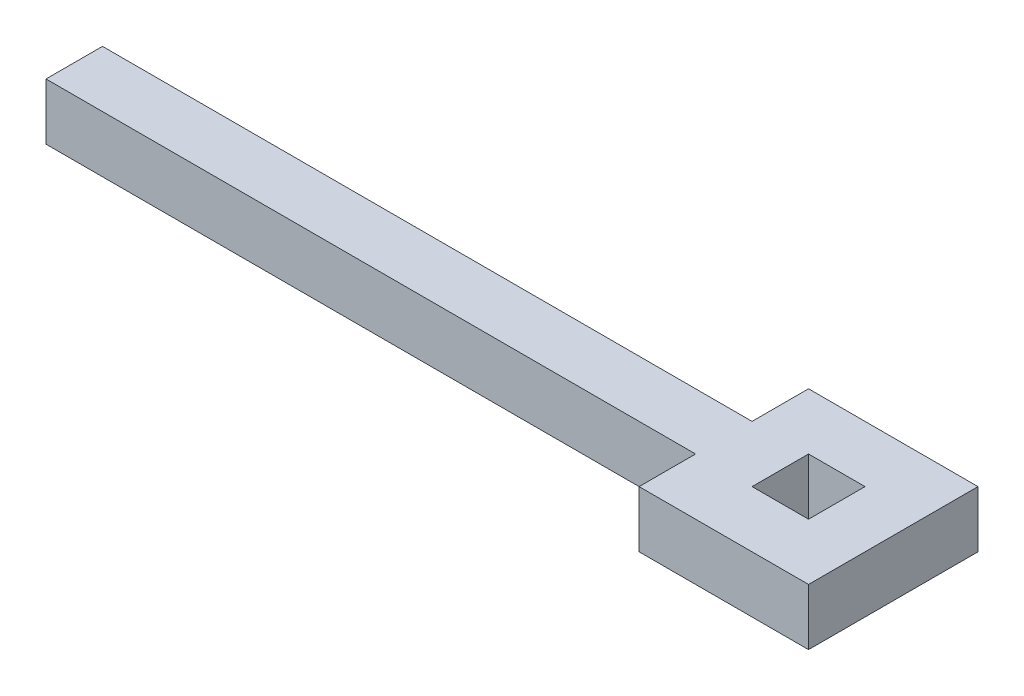
ISO-10303-21;
HEADER;
FILE_DESCRIPTION(('STEP AP214'),'2;1');
FILE_NAME('part.step','',(''),(''),'','','');
FILE_SCHEMA(('AUTOMOTIVE_DESIGN { 1 0 10303 214 1 1 1 1 }'));
ENDSEC;
DATA;
#1=APPLICATION_CONTEXT('core data for automotive mechanical design processes');
#2=APPLICATION_PROTOCOL_DEFINITION('international standard','automotive_design',2000,#1);
#3=PRODUCT_CONTEXT('',#1,'mechanical');
#4=PRODUCT('Part','Part','',(#3));
#5=PRODUCT_RELATED_PRODUCT_CATEGORY('part','',(#4));
#6=PRODUCT_DEFINITION_FORMATION('','',#4);
#7=PRODUCT_DEFINITION_CONTEXT('part definition',#1,'design');
#8=PRODUCT_DEFINITION('design','',#6,#7);
#9=PRODUCT_DEFINITION_SHAPE('','',#8);
#10=(LENGTH_UNIT() NAMED_UNIT(*) SI_UNIT(.MILLI.,.METRE.));
#11=(NAMED_UNIT(*) PLANE_ANGLE_UNIT() SI_UNIT($,.RADIAN.));
#12=(NAMED_UNIT(*) SI_UNIT($,.STERADIAN.) SOLID_ANGLE_UNIT());
#13=UNCERTAINTY_MEASURE_WITH_UNIT(LENGTH_MEASURE(1.E-05),#10,'distance_accuracy_value','');
#14=(GEOMETRIC_REPRESENTATION_CONTEXT(3) GLOBAL_UNCERTAINTY_ASSIGNED_CONTEXT((#13)) GLOBAL_UNIT_ASSIGNED_CONTEXT((#10,
#11,#12)) REPRESENTATION_CONTEXT('',''));
#15=CARTESIAN_POINT('',(0.,0.,0.));
#16=DIRECTION('',(0.,0.,1.));
#17=DIRECTION('',(1.,0.,0.));
#18=AXIS2_PLACEMENT_3D('',#15,#16,#17);
#19=CARTESIAN_POINT('',(0.,12.7,-12.7));
#20=DIRECTION('',(0.,0.,1.));
#21=DIRECTION('',(1.,0.,0.));
#22=AXIS2_PLACEMENT_3D('',#19,#20,#21);
#23=PLANE('',#22);
#24=DIRECTION('',(-1.,0.,0.));
#25=VECTOR('',#24,1.);
#26=CARTESIAN_POINT('',(0.,0.,-12.7));
#27=LINE('',#26,#25);
#28=CARTESIAN_POINT('',(0.,0.,-12.7));
#29=VERTEX_POINT('',#28);
#30=CARTESIAN_POINT('',(-146.05,0.,-12.7));
#31=VERTEX_POINT('',#30);
#32=EDGE_CURVE('E213',#29,#31,#27,.T.);
#33=ORIENTED_EDGE('',*,*,#32,.T.);
#34=DIRECTION('',(0.,-1.,0.));
#35=VECTOR('',#34,1.);
#36=CARTESIAN_POINT('',(-146.05,12.7,-12.7));
#37=LINE('',#36,#35);
#38=CARTESIAN_POINT('',(-146.05,12.7,-12.7));
#39=VERTEX_POINT('',#38);
#40=EDGE_CURVE('E239',#39,#31,#37,.T.);
#41=ORIENTED_EDGE('',*,*,#40,.F.);
#42=DIRECTION('',(-1.,0.,0.));
#43=VECTOR('',#42,1.);
#44=CARTESIAN_POINT('',(0.,12.7,-12.7));
#45=LINE('',#44,#43);
#46=CARTESIAN_POINT('',(0.,12.7,-12.7));
#47=VERTEX_POINT('',#46);
#48=EDGE_CURVE('E214',#47,#39,#45,.T.);
#49=ORIENTED_EDGE('',*,*,#48,.F.);
#50=DIRECTION('',(0.,-1.,0.));
#51=VECTOR('',#50,1.);
#52=CARTESIAN_POINT('',(0.,12.7,-12.7));
#53=LINE('',#52,#51);
#54=EDGE_CURVE('E243',#47,#29,#53,.T.);
#55=ORIENTED_EDGE('',*,*,#54,.T.);
#56=EDGE_LOOP('',(#33,#41,#49,#55));
#57=FACE_BOUND('',#56,.T.);
#58=ADVANCED_FACE('F43',(#57),#23,.F.);
#59=CARTESIAN_POINT('',(-146.05,12.7,0.));
#60=DIRECTION('',(1.,0.,0.));
#61=DIRECTION('',(0.,0.,-1.));
#62=AXIS2_PLACEMENT_3D('',#59,#60,#61);
#63=PLANE('',#62);
#64=DIRECTION('',(0.,0.,1.));
#65=VECTOR('',#64,1.);
#66=CARTESIAN_POINT('',(-146.05,0.,0.));
#67=LINE('',#66,#65);
#68=CARTESIAN_POINT('',(-146.05,0.,0.));
#69=VERTEX_POINT('',#68);
#70=EDGE_CURVE('E227',#31,#69,#67,.T.);
#71=ORIENTED_EDGE('',*,*,#70,.T.);
#72=DIRECTION('',(0.,-1.,0.));
#73=VECTOR('',#72,1.);
#74=CARTESIAN_POINT('',(-146.05,12.7,0.));
#75=LINE('',#74,#73);
#76=CARTESIAN_POINT('',(-146.05,12.7,0.));
#77=VERTEX_POINT('',#76);
#78=EDGE_CURVE('E235',#77,#69,#75,.T.);
#79=ORIENTED_EDGE('',*,*,#78,.F.);
#80=DIRECTION('',(0.,0.,1.));
#81=VECTOR('',#80,1.);
#82=CARTESIAN_POINT('',(-146.05,12.7,0.));
#83=LINE('',#82,#81);
#84=EDGE_CURVE('E217',#39,#77,#83,.T.);
#85=ORIENTED_EDGE('',*,*,#84,.F.);
#86=ORIENTED_EDGE('',*,*,#40,.T.);
#87=EDGE_LOOP('',(#71,#79,#85,#86));
#88=FACE_BOUND('',#87,.T.);
#89=ADVANCED_FACE('F275',(#88),#63,.F.);
#90=CARTESIAN_POINT('',(0.,12.7,0.));
#91=DIRECTION('',(0.,0.,-1.));
#92=DIRECTION('',(-1.,0.,0.));
#93=AXIS2_PLACEMENT_3D('',#90,#91,#92);
#94=PLANE('',#93);
#95=DIRECTION('',(1.,0.,0.));
#96=VECTOR('',#95,1.);
#97=CARTESIAN_POINT('',(0.,0.,0.));
#98=LINE('',#97,#96);
#99=CARTESIAN_POINT('',(0.,0.,0.));
#100=VERTEX_POINT('',#99);
#101=EDGE_CURVE('E218',#69,#100,#98,.T.);
#102=ORIENTED_EDGE('',*,*,#101,.T.);
#103=DIRECTION('',(0.,-1.,0.));
#104=VECTOR('',#103,1.);
#105=CARTESIAN_POINT('',(0.,12.7,0.));
#106=LINE('',#105,#104);
#107=CARTESIAN_POINT('',(0.,12.7,0.));
#108=VERTEX_POINT('',#107);
#109=EDGE_CURVE('E224',#108,#100,#106,.T.);
#110=ORIENTED_EDGE('',*,*,#109,.F.);
#111=DIRECTION('',(1.,0.,0.));
#112=VECTOR('',#111,1.);
#113=CARTESIAN_POINT('',(0.,12.7,0.));
#114=LINE('',#113,#112);
#115=EDGE_CURVE('E221',#77,#108,#114,.T.);
#116=ORIENTED_EDGE('',*,*,#115,.F.);
#117=ORIENTED_EDGE('',*,*,#78,.T.);
#118=EDGE_LOOP('',(#102,#110,#116,#117));
#119=FACE_BOUND('',#118,.T.);
#120=ADVANCED_FACE('F280',(#119),#94,.F.);
#121=CARTESIAN_POINT('',(0.,12.7,0.));
#122=DIRECTION('',(0.,1.,0.));
#123=DIRECTION('',(0.,0.,1.));
#124=AXIS2_PLACEMENT_3D('',#121,#122,#123);
#125=PLANE('',#124);
#126=DIRECTION('',(0.,0.,1.));
#127=VECTOR('',#126,1.);
#128=CARTESIAN_POINT('',(12.7,12.7,0.));
#129=LINE('',#128,#127);
#130=CARTESIAN_POINT('',(12.7,12.7,-12.7));
#131=VERTEX_POINT('',#130);
#132=CARTESIAN_POINT('',(12.7,12.7,0.));
#133=VERTEX_POINT('',#132);
#134=EDGE_CURVE('E58',#131,#133,#129,.T.);
#135=ORIENTED_EDGE('',*,*,#134,.F.);
#136=DIRECTION('',(-1.,0.,0.));
#137=VECTOR('',#136,1.);
#138=CARTESIAN_POINT('',(12.7,12.7,-12.7));
#139=LINE('',#138,#137);
#140=CARTESIAN_POINT('',(25.4,12.7,-12.7));
#141=VERTEX_POINT('',#140);
#142=EDGE_CURVE('E153',#141,#131,#139,.T.);
#143=ORIENTED_EDGE('',*,*,#142,.F.);
#144=DIRECTION('',(0.,0.,-1.));
#145=VECTOR('',#144,1.);
#146=CARTESIAN_POINT('',(25.4,12.7,0.));
#147=LINE('',#146,#145);
#148=CARTESIAN_POINT('',(25.4,12.7,0.));
#149=VERTEX_POINT('',#148);
#150=EDGE_CURVE('E135',#149,#141,#147,.T.);
#151=ORIENTED_EDGE('',*,*,#150,.F.);
#152=DIRECTION('',(1.,0.,0.));
#153=VECTOR('',#152,1.);
#154=CARTESIAN_POINT('',(12.7,12.7,0.));
#155=LINE('',#154,#153);
#156=EDGE_CURVE('E145',#133,#149,#155,.T.);
#157=ORIENTED_EDGE('',*,*,#156,.F.);
#158=EDGE_LOOP('',(#135,#143,#151,#157));
#159=FACE_BOUND('',#158,.T.);
#160=ORIENTED_EDGE('',*,*,#115,.T.);
#161=DIRECTION('',(0.,0.,1.));
#162=VECTOR('',#161,1.);
#163=CARTESIAN_POINT('',(0.,12.7,12.7));
#164=LINE('',#163,#162);
#165=CARTESIAN_POINT('',(0.,12.7,12.7));
#166=VERTEX_POINT('',#165);
#167=EDGE_CURVE('E194',#108,#166,#164,.T.);
#168=ORIENTED_EDGE('',*,*,#167,.T.);
#169=DIRECTION('',(-1.,0.,0.));
#170=VECTOR('',#169,1.);
#171=CARTESIAN_POINT('',(38.1,12.7,12.7));
#172=LINE('',#171,#170);
#173=CARTESIAN_POINT('',(38.1,12.7,12.7));
#174=VERTEX_POINT('',#173);
#175=EDGE_CURVE('E182',#174,#166,#172,.T.);
#176=ORIENTED_EDGE('',*,*,#175,.F.);
#177=DIRECTION('',(0.,0.,1.));
#178=VECTOR('',#177,1.);
#179=CARTESIAN_POINT('',(38.1,12.7,12.7));
#180=LINE('',#179,#178);
#181=CARTESIAN_POINT('',(38.1,12.7,-25.4));
#182=VERTEX_POINT('',#181);
#183=EDGE_CURVE('E179',#182,#174,#180,.T.);
#184=ORIENTED_EDGE('',*,*,#183,.F.);
#185=DIRECTION('',(-1.,0.,0.));
#186=VECTOR('',#185,1.);
#187=CARTESIAN_POINT('',(38.1,12.7,-25.4));
#188=LINE('',#187,#186);
#189=CARTESIAN_POINT('',(0.,12.7,-25.4));
#190=VERTEX_POINT('',#189);
#191=EDGE_CURVE('E201',#182,#190,#188,.T.);
#192=ORIENTED_EDGE('',*,*,#191,.T.);
#193=EDGE_CURVE('E173',#190,#47,#164,.T.);
#194=ORIENTED_EDGE('',*,*,#193,.T.);
#195=ORIENTED_EDGE('',*,*,#48,.T.);
#196=ORIENTED_EDGE('',*,*,#84,.T.);
#197=EDGE_LOOP('',(#160,#168,#176,#184,#192,#194,#195,#196));
#198=FACE_BOUND('',#197,.T.);
#199=ADVANCED_FACE('F150',(#159,#198),#125,.T.);
#200=CARTESIAN_POINT('',(0.,0.,0.));
#201=DIRECTION('',(0.,1.,0.));
#202=DIRECTION('',(0.,0.,1.));
#203=AXIS2_PLACEMENT_3D('',#200,#201,#202);
#204=PLANE('',#203);
#205=DIRECTION('',(-1.,0.,0.));
#206=VECTOR('',#205,1.);
#207=CARTESIAN_POINT('',(0.,0.,-12.7));
#208=LINE('',#207,#206);
#209=CARTESIAN_POINT('',(25.4,0.,-12.7));
#210=VERTEX_POINT('',#209);
#211=CARTESIAN_POINT('',(12.7,0.,-12.7));
#212=VERTEX_POINT('',#211);
#213=EDGE_CURVE('E51',#210,#212,#208,.T.);
#214=ORIENTED_EDGE('',*,*,#213,.T.);
#215=DIRECTION('',(0.,0.,1.));
#216=VECTOR('',#215,1.);
#217=CARTESIAN_POINT('',(12.7,0.,0.));
#218=LINE('',#217,#216);
#219=CARTESIAN_POINT('',(12.7,0.,0.));
#220=VERTEX_POINT('',#219);
#221=EDGE_CURVE('E11',#212,#220,#218,.T.);
#222=ORIENTED_EDGE('',*,*,#221,.T.);
#223=DIRECTION('',(1.,0.,0.));
#224=VECTOR('',#223,1.);
#225=CARTESIAN_POINT('',(0.,0.,0.));
#226=LINE('',#225,#224);
#227=CARTESIAN_POINT('',(25.4,0.,0.));
#228=VERTEX_POINT('',#227);
#229=EDGE_CURVE('E247',#220,#228,#226,.T.);
#230=ORIENTED_EDGE('',*,*,#229,.T.);
#231=DIRECTION('',(0.,0.,-1.));
#232=VECTOR('',#231,1.);
#233=CARTESIAN_POINT('',(25.4,0.,0.));
#234=LINE('',#233,#232);
#235=EDGE_CURVE('E138',#228,#210,#234,.T.);
#236=ORIENTED_EDGE('',*,*,#235,.T.);
#237=EDGE_LOOP('',(#214,#222,#230,#236));
#238=FACE_BOUND('',#237,.T.);
#239=ORIENTED_EDGE('',*,*,#32,.F.);
#240=DIRECTION('',(0.,0.,-1.));
#241=VECTOR('',#240,1.);
#242=CARTESIAN_POINT('',(0.,0.,12.7));
#243=LINE('',#242,#241);
#244=CARTESIAN_POINT('',(0.,0.,-25.4));
#245=VERTEX_POINT('',#244);
#246=EDGE_CURVE('E186',#29,#245,#243,.T.);
#247=ORIENTED_EDGE('',*,*,#246,.T.);
#248=DIRECTION('',(-1.,0.,0.));
#249=VECTOR('',#248,1.);
#250=CARTESIAN_POINT('',(38.1,0.,-25.4));
#251=LINE('',#250,#249);
#252=CARTESIAN_POINT('',(38.1,0.,-25.4));
#253=VERTEX_POINT('',#252);
#254=EDGE_CURVE('E205',#253,#245,#251,.T.);
#255=ORIENTED_EDGE('',*,*,#254,.F.);
#256=DIRECTION('',(0.,0.,-1.));
#257=VECTOR('',#256,1.);
#258=CARTESIAN_POINT('',(38.1,0.,12.7));
#259=LINE('',#258,#257);
#260=CARTESIAN_POINT('',(38.1,0.,12.7));
#261=VERTEX_POINT('',#260);
#262=EDGE_CURVE('E172',#261,#253,#259,.T.);
#263=ORIENTED_EDGE('',*,*,#262,.F.);
#264=DIRECTION('',(-1.,0.,0.));
#265=VECTOR('',#264,1.);
#266=CARTESIAN_POINT('',(38.1,0.,12.7));
#267=LINE('',#266,#265);
#268=CARTESIAN_POINT('',(0.,0.,12.7));
#269=VERTEX_POINT('',#268);
#270=EDGE_CURVE('E209',#261,#269,#267,.T.);
#271=ORIENTED_EDGE('',*,*,#270,.T.);
#272=EDGE_CURVE('E187',#269,#100,#243,.T.);
#273=ORIENTED_EDGE('',*,*,#272,.T.);
#274=ORIENTED_EDGE('',*,*,#101,.F.);
#275=ORIENTED_EDGE('',*,*,#70,.F.);
#276=EDGE_LOOP('',(#239,#247,#255,#263,#271,#273,#274,#275));
#277=FACE_BOUND('',#276,.T.);
#278=ADVANCED_FACE('F254',(#238,#277),#204,.F.);
#279=CARTESIAN_POINT('',(0.,0.,0.));
#280=DIRECTION('',(-1.,0.,0.));
#281=DIRECTION('',(0.,0.,1.));
#282=AXIS2_PLACEMENT_3D('',#279,#280,#281);
#283=PLANE('',#282);
#284=ORIENTED_EDGE('',*,*,#54,.F.);
#285=ORIENTED_EDGE('',*,*,#193,.F.);
#286=DIRECTION('',(0.,1.,0.));
#287=VECTOR('',#286,1.);
#288=CARTESIAN_POINT('',(0.,0.,-25.4));
#289=LINE('',#288,#287);
#290=EDGE_CURVE('E191',#245,#190,#289,.T.);
#291=ORIENTED_EDGE('',*,*,#290,.F.);
#292=ORIENTED_EDGE('',*,*,#246,.F.);
#293=EDGE_LOOP('',(#284,#285,#291,#292));
#294=FACE_BOUND('',#293,.T.);
#295=ADVANCED_FACE('F271',(#294),#283,.T.);
#296=CARTESIAN_POINT('',(38.1,0.,12.7));
#297=DIRECTION('',(0.,0.,-1.));
#298=DIRECTION('',(-1.,0.,0.));
#299=AXIS2_PLACEMENT_3D('',#296,#297,#298);
#300=PLANE('',#299);
#301=DIRECTION('',(0.,-1.,0.));
#302=VECTOR('',#301,1.);
#303=CARTESIAN_POINT('',(0.,0.,12.7));
#304=LINE('',#303,#302);
#305=EDGE_CURVE('E163',#166,#269,#304,.T.);
#306=ORIENTED_EDGE('',*,*,#305,.T.);
#307=ORIENTED_EDGE('',*,*,#270,.F.);
#308=DIRECTION('',(0.,-1.,0.));
#309=VECTOR('',#308,1.);
#310=CARTESIAN_POINT('',(38.1,0.,12.7));
#311=LINE('',#310,#309);
#312=EDGE_CURVE('E168',#174,#261,#311,.T.);
#313=ORIENTED_EDGE('',*,*,#312,.F.);
#314=ORIENTED_EDGE('',*,*,#175,.T.);
#315=EDGE_LOOP('',(#306,#307,#313,#314));
#316=FACE_BOUND('',#315,.T.);
#317=ADVANCED_FACE('F310',(#316),#300,.F.);
#318=CARTESIAN_POINT('',(38.1,0.,-25.4));
#319=DIRECTION('',(0.,0.,1.));
#320=DIRECTION('',(1.,0.,0.));
#321=AXIS2_PLACEMENT_3D('',#318,#319,#320);
#322=PLANE('',#321);
#323=ORIENTED_EDGE('',*,*,#290,.T.);
#324=ORIENTED_EDGE('',*,*,#191,.F.);
#325=DIRECTION('',(0.,1.,0.));
#326=VECTOR('',#325,1.);
#327=CARTESIAN_POINT('',(38.1,0.,-25.4));
#328=LINE('',#327,#326);
#329=EDGE_CURVE('E176',#253,#182,#328,.T.);
#330=ORIENTED_EDGE('',*,*,#329,.F.);
#331=ORIENTED_EDGE('',*,*,#254,.T.);
#332=EDGE_LOOP('',(#323,#324,#330,#331));
#333=FACE_BOUND('',#332,.T.);
#334=ADVANCED_FACE('F302',(#333),#322,.F.);
#335=CARTESIAN_POINT('',(38.1,0.,0.));
#336=DIRECTION('',(-1.,0.,0.));
#337=DIRECTION('',(0.,0.,1.));
#338=AXIS2_PLACEMENT_3D('',#335,#336,#337);
#339=PLANE('',#338);
#340=ORIENTED_EDGE('',*,*,#312,.T.);
#341=ORIENTED_EDGE('',*,*,#262,.T.);
#342=ORIENTED_EDGE('',*,*,#329,.T.);
#343=ORIENTED_EDGE('',*,*,#183,.T.);
#344=EDGE_LOOP('',(#340,#341,#342,#343));
#345=FACE_BOUND('',#344,.T.);
#346=ADVANCED_FACE('F268',(#345),#339,.F.);
#347=ORIENTED_EDGE('',*,*,#167,.F.);
#348=ORIENTED_EDGE('',*,*,#109,.T.);
#349=ORIENTED_EDGE('',*,*,#272,.F.);
#350=ORIENTED_EDGE('',*,*,#305,.F.);
#351=EDGE_LOOP('',(#347,#348,#349,#350));
#352=FACE_BOUND('',#351,.T.);
#353=ADVANCED_FACE('F261',(#352),#283,.T.);
#354=CARTESIAN_POINT('',(12.7,-25.4,0.));
#355=DIRECTION('',(-1.,0.,0.));
#356=DIRECTION('',(0.,0.,1.));
#357=AXIS2_PLACEMENT_3D('',#354,#355,#356);
#358=PLANE('',#357);
#359=DIRECTION('',(0.,1.,0.));
#360=VECTOR('',#359,1.);
#361=CARTESIAN_POINT('',(12.7,-25.4,-12.7));
#362=LINE('',#361,#360);
#363=EDGE_CURVE('E160',#212,#131,#362,.T.);
#364=ORIENTED_EDGE('',*,*,#363,.T.);
#365=ORIENTED_EDGE('',*,*,#134,.T.);
#366=DIRECTION('',(0.,1.,0.));
#367=VECTOR('',#366,1.);
#368=CARTESIAN_POINT('',(12.7,-25.4,0.));
#369=LINE('',#368,#367);
#370=EDGE_CURVE('E142',#220,#133,#369,.T.);
#371=ORIENTED_EDGE('',*,*,#370,.F.);
#372=ORIENTED_EDGE('',*,*,#221,.F.);
#373=EDGE_LOOP('',(#364,#365,#371,#372));
#374=FACE_BOUND('',#373,.T.);
#375=ADVANCED_FACE('F259',(#374),#358,.F.);
#376=CARTESIAN_POINT('',(12.7,-25.4,-12.7));
#377=DIRECTION('',(0.,0.,-1.));
#378=DIRECTION('',(-1.,0.,0.));
#379=AXIS2_PLACEMENT_3D('',#376,#377,#378);
#380=PLANE('',#379);
#381=DIRECTION('',(0.,1.,0.));
#382=VECTOR('',#381,1.);
#383=CARTESIAN_POINT('',(25.4,-25.4,-12.7));
#384=LINE('',#383,#382);
#385=EDGE_CURVE('E141',#210,#141,#384,.T.);
#386=ORIENTED_EDGE('',*,*,#385,.T.);
#387=ORIENTED_EDGE('',*,*,#142,.T.);
#388=ORIENTED_EDGE('',*,*,#363,.F.);
#389=ORIENTED_EDGE('',*,*,#213,.F.);
#390=EDGE_LOOP('',(#386,#387,#388,#389));
#391=FACE_BOUND('',#390,.T.);
#392=ADVANCED_FACE('F258',(#391),#380,.F.);
#393=CARTESIAN_POINT('',(25.4,-25.4,0.));
#394=DIRECTION('',(1.,0.,0.));
#395=DIRECTION('',(0.,0.,-1.));
#396=AXIS2_PLACEMENT_3D('',#393,#394,#395);
#397=PLANE('',#396);
#398=DIRECTION('',(0.,1.,0.));
#399=VECTOR('',#398,1.);
#400=CARTESIAN_POINT('',(25.4,-25.4,0.));
#401=LINE('',#400,#399);
#402=EDGE_CURVE('E66',#228,#149,#401,.T.);
#403=ORIENTED_EDGE('',*,*,#402,.T.);
#404=ORIENTED_EDGE('',*,*,#150,.T.);
#405=ORIENTED_EDGE('',*,*,#385,.F.);
#406=ORIENTED_EDGE('',*,*,#235,.F.);
#407=EDGE_LOOP('',(#403,#404,#405,#406));
#408=FACE_BOUND('',#407,.T.);
#409=ADVANCED_FACE('F132',(#408),#397,.F.);
#410=CARTESIAN_POINT('',(12.7,-25.4,0.));
#411=DIRECTION('',(0.,0.,1.));
#412=DIRECTION('',(1.,0.,0.));
#413=AXIS2_PLACEMENT_3D('',#410,#411,#412);
#414=PLANE('',#413);
#415=ORIENTED_EDGE('',*,*,#370,.T.);
#416=ORIENTED_EDGE('',*,*,#156,.T.);
#417=ORIENTED_EDGE('',*,*,#402,.F.);
#418=ORIENTED_EDGE('',*,*,#229,.F.);
#419=EDGE_LOOP('',(#415,#416,#417,#418));
#420=FACE_BOUND('',#419,.T.);
#421=ADVANCED_FACE('F146',(#420),#414,.F.);
#422=CLOSED_SHELL('',(#58,#89,#120,#199,#278,#295,#317,#334,#346,#353,#375,#392,#409,#421));
#423=MANIFOLD_SOLID_BREP('B2',#422);
#424=ADVANCED_BREP_SHAPE_REPRESENTATION('',(#18,#423),#14);
#425=SHAPE_DEFINITION_REPRESENTATION(#9,#424);
ENDSEC;
END-ISO-10303-21;
